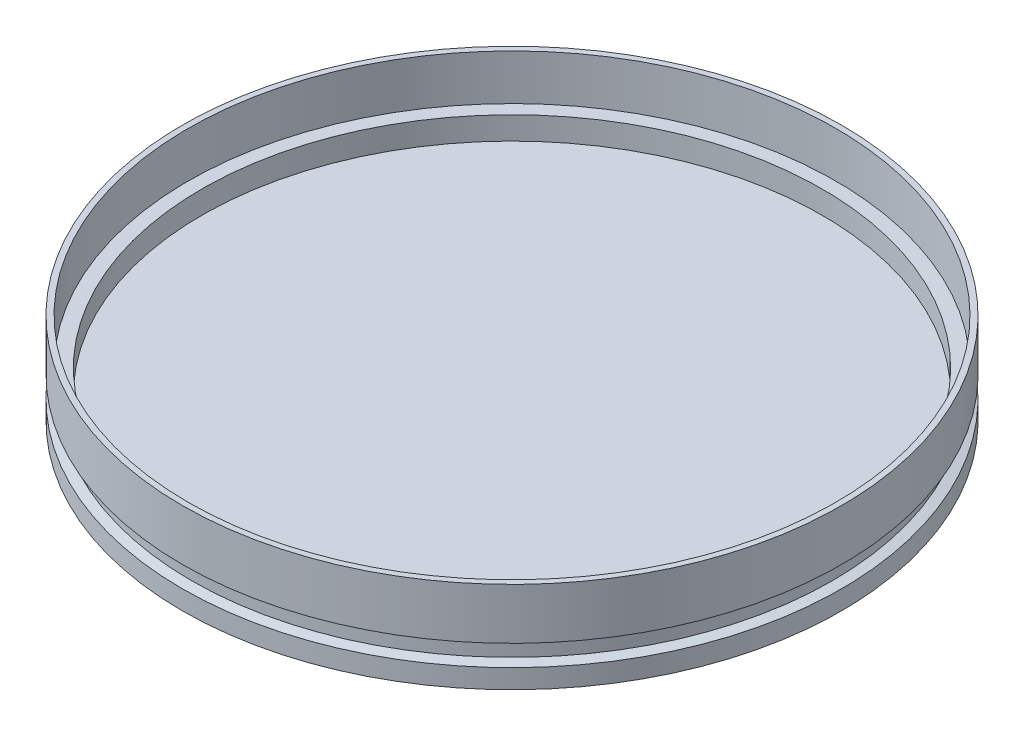
ISO-10303-21;
HEADER;
FILE_DESCRIPTION(('STEP AP214'),'2;1');
FILE_NAME('part.step','',(''),(''),'','','');
FILE_SCHEMA(('AUTOMOTIVE_DESIGN { 1 0 10303 214 1 1 1 1 }'));
ENDSEC;
DATA;
#1=APPLICATION_CONTEXT('core data for automotive mechanical design processes');
#2=APPLICATION_PROTOCOL_DEFINITION('international standard','automotive_design',2000,#1);
#3=PRODUCT_CONTEXT('',#1,'mechanical');
#4=PRODUCT('Part','Part','',(#3));
#5=PRODUCT_RELATED_PRODUCT_CATEGORY('part','',(#4));
#6=PRODUCT_DEFINITION_FORMATION('','',#4);
#7=PRODUCT_DEFINITION_CONTEXT('part definition',#1,'design');
#8=PRODUCT_DEFINITION('design','',#6,#7);
#9=PRODUCT_DEFINITION_SHAPE('','',#8);
#10=(LENGTH_UNIT() NAMED_UNIT(*) SI_UNIT(.MILLI.,.METRE.));
#11=(NAMED_UNIT(*) PLANE_ANGLE_UNIT() SI_UNIT($,.RADIAN.));
#12=(NAMED_UNIT(*) SI_UNIT($,.STERADIAN.) SOLID_ANGLE_UNIT());
#13=UNCERTAINTY_MEASURE_WITH_UNIT(LENGTH_MEASURE(1.E-05),#10,'distance_accuracy_value','');
#14=(GEOMETRIC_REPRESENTATION_CONTEXT(3) GLOBAL_UNCERTAINTY_ASSIGNED_CONTEXT((#13)) GLOBAL_UNIT_ASSIGNED_CONTEXT((#10,
#11,#12)) REPRESENTATION_CONTEXT('',''));
#15=CARTESIAN_POINT('',(0.,0.,0.));
#16=DIRECTION('',(0.,0.,1.));
#17=DIRECTION('',(1.,0.,0.));
#18=AXIS2_PLACEMENT_3D('',#15,#16,#17);
#19=CARTESIAN_POINT('',(0.,20.,0.));
#20=DIRECTION('',(0.,-1.,0.));
#21=DIRECTION('',(0.,0.,-1.));
#22=AXIS2_PLACEMENT_3D('',#19,#20,#21);
#23=CYLINDRICAL_SURFACE('',#22,72.25);
#24=CARTESIAN_POINT('',(0.,8.80384757729339,0.));
#25=DIRECTION('',(0.,1.,0.));
#26=DIRECTION('',(0.,0.,1.));
#27=AXIS2_PLACEMENT_3D('',#24,#25,#26);
#28=CIRCLE('',#27,72.25);
#29=CARTESIAN_POINT('',(0.,8.80384757729339,72.25));
#30=VERTEX_POINT('',#29);
#31=EDGE_CURVE('E52',#30,#30,#28,.T.);
#32=ORIENTED_EDGE('',*,*,#31,.T.);
#33=EDGE_LOOP('',(#32));
#34=FACE_BOUND('',#33,.T.);
#35=CARTESIAN_POINT('',(0.,20.,0.));
#36=DIRECTION('',(0.,1.,0.));
#37=DIRECTION('',(0.,0.,1.));
#38=AXIS2_PLACEMENT_3D('',#35,#36,#37);
#39=CIRCLE('',#38,72.25);
#40=CARTESIAN_POINT('',(0.,20.,72.25));
#41=VERTEX_POINT('',#40);
#42=EDGE_CURVE('E58',#41,#41,#39,.T.);
#43=ORIENTED_EDGE('',*,*,#42,.F.);
#44=EDGE_LOOP('',(#43));
#45=FACE_BOUND('',#44,.T.);
#46=ADVANCED_FACE('F32',(#34,#45),#23,.T.);
#47=CARTESIAN_POINT('',(0.,20.,0.));
#48=DIRECTION('',(0.,-1.,0.));
#49=DIRECTION('',(0.,0.,-1.));
#50=AXIS2_PLACEMENT_3D('',#47,#48,#49);
#51=CYLINDRICAL_SURFACE('',#50,71.);
#52=CARTESIAN_POINT('',(0.,10.,0.));
#53=DIRECTION('',(0.,1.,0.));
#54=DIRECTION('',(0.,0.,1.));
#55=AXIS2_PLACEMENT_3D('',#52,#53,#54);
#56=CIRCLE('',#55,71.);
#57=CARTESIAN_POINT('',(0.,10.,71.));
#58=VERTEX_POINT('',#57);
#59=EDGE_CURVE('E55',#58,#58,#56,.T.);
#60=ORIENTED_EDGE('',*,*,#59,.F.);
#61=EDGE_LOOP('',(#60));
#62=FACE_BOUND('',#61,.T.);
#63=CARTESIAN_POINT('',(0.,20.,0.));
#64=DIRECTION('',(0.,1.,0.));
#65=DIRECTION('',(0.,0.,1.));
#66=AXIS2_PLACEMENT_3D('',#63,#64,#65);
#67=CIRCLE('',#66,71.);
#68=CARTESIAN_POINT('',(0.,20.,71.));
#69=VERTEX_POINT('',#68);
#70=EDGE_CURVE('E62',#69,#69,#67,.T.);
#71=ORIENTED_EDGE('',*,*,#70,.T.);
#72=EDGE_LOOP('',(#71));
#73=FACE_BOUND('',#72,.T.);
#74=ADVANCED_FACE('F80',(#62,#73),#51,.F.);
#75=CARTESIAN_POINT('',(0.,4.19615242270661,0.));
#76=DIRECTION('',(0.,-1.,0.));
#77=DIRECTION('',(0.,0.,-1.));
#78=AXIS2_PLACEMENT_3D('',#75,#76,#77);
#79=CIRCLE('',#78,72.25);
#80=CARTESIAN_POINT('',(0.,4.19615242270661,-72.25));
#81=VERTEX_POINT('',#80);
#82=EDGE_CURVE('E43',#81,#81,#79,.T.);
#83=ORIENTED_EDGE('',*,*,#82,.T.);
#84=EDGE_LOOP('',(#83));
#85=FACE_BOUND('',#84,.T.);
#86=CARTESIAN_POINT('',(0.,0.,0.));
#87=DIRECTION('',(0.,1.,0.));
#88=DIRECTION('',(0.,0.,1.));
#89=AXIS2_PLACEMENT_3D('',#86,#87,#88);
#90=CIRCLE('',#89,72.25);
#91=CARTESIAN_POINT('',(0.,0.,72.25));
#92=VERTEX_POINT('',#91);
#93=EDGE_CURVE('E59',#92,#92,#90,.T.);
#94=ORIENTED_EDGE('',*,*,#93,.T.);
#95=EDGE_LOOP('',(#94));
#96=FACE_BOUND('',#95,.T.);
#97=ADVANCED_FACE('F83',(#85,#96),#23,.T.);
#98=CARTESIAN_POINT('',(0.,20.,0.));
#99=DIRECTION('',(0.,1.,0.));
#100=DIRECTION('',(0.,0.,1.));
#101=AXIS2_PLACEMENT_3D('',#98,#99,#100);
#102=PLANE('',#101);
#103=ORIENTED_EDGE('',*,*,#70,.F.);
#104=EDGE_LOOP('',(#103));
#105=FACE_BOUND('',#104,.T.);
#106=ORIENTED_EDGE('',*,*,#42,.T.);
#107=EDGE_LOOP('',(#106));
#108=FACE_BOUND('',#107,.T.);
#109=ADVANCED_FACE('F87',(#105,#108),#102,.T.);
#110=CARTESIAN_POINT('',(0.,0.,0.));
#111=DIRECTION('',(0.,1.,0.));
#112=DIRECTION('',(0.,0.,1.));
#113=AXIS2_PLACEMENT_3D('',#110,#111,#112);
#114=PLANE('',#113);
#115=ORIENTED_EDGE('',*,*,#93,.F.);
#116=EDGE_LOOP('',(#115));
#117=FACE_BOUND('',#116,.T.);
#118=ADVANCED_FACE('F90',(#117),#114,.F.);
#119=CARTESIAN_POINT('',(0.,10.,0.));
#120=DIRECTION('',(0.,-1.,0.));
#121=DIRECTION('',(0.,0.,-1.));
#122=AXIS2_PLACEMENT_3D('',#119,#120,#121);
#123=CYLINDRICAL_SURFACE('',#122,68.);
#124=CARTESIAN_POINT('',(0.,5.,0.));
#125=DIRECTION('',(0.,1.,0.));
#126=DIRECTION('',(0.,0.,1.));
#127=AXIS2_PLACEMENT_3D('',#124,#125,#126);
#128=CIRCLE('',#127,68.);
#129=CARTESIAN_POINT('',(0.,5.,68.));
#130=VERTEX_POINT('',#129);
#131=EDGE_CURVE('E10',#130,#130,#128,.T.);
#132=ORIENTED_EDGE('',*,*,#131,.F.);
#133=EDGE_LOOP('',(#132));
#134=FACE_BOUND('',#133,.T.);
#135=CARTESIAN_POINT('',(0.,10.,0.));
#136=DIRECTION('',(0.,1.,0.));
#137=DIRECTION('',(0.,0.,1.));
#138=AXIS2_PLACEMENT_3D('',#135,#136,#137);
#139=CIRCLE('',#138,68.);
#140=CARTESIAN_POINT('',(0.,10.,68.));
#141=VERTEX_POINT('',#140);
#142=EDGE_CURVE('E63',#141,#141,#139,.T.);
#143=ORIENTED_EDGE('',*,*,#142,.T.);
#144=EDGE_LOOP('',(#143));
#145=FACE_BOUND('',#144,.T.);
#146=ADVANCED_FACE('F71',(#134,#145),#123,.F.);
#147=CARTESIAN_POINT('',(0.,10.,0.));
#148=DIRECTION('',(0.,1.,0.));
#149=DIRECTION('',(0.,0.,1.));
#150=AXIS2_PLACEMENT_3D('',#147,#148,#149);
#151=PLANE('',#150);
#152=ORIENTED_EDGE('',*,*,#142,.F.);
#153=EDGE_LOOP('',(#152));
#154=FACE_BOUND('',#153,.T.);
#155=ORIENTED_EDGE('',*,*,#59,.T.);
#156=EDGE_LOOP('',(#155));
#157=FACE_BOUND('',#156,.T.);
#158=ADVANCED_FACE('F73',(#154,#157),#151,.T.);
#159=CARTESIAN_POINT('',(0.,0.,0.));
#160=DIRECTION('',(0.,-1.,0.));
#161=DIRECTION('',(0.,0.,-1.));
#162=AXIS2_PLACEMENT_3D('',#159,#160,#161);
#163=CYLINDRICAL_SURFACE('',#162,70.25);
#164=CARTESIAN_POINT('',(0.,4.73205080756887,0.));
#165=DIRECTION('',(0.,-1.,0.));
#166=DIRECTION('',(0.,0.,-1.));
#167=AXIS2_PLACEMENT_3D('',#164,#165,#166);
#168=CIRCLE('',#167,70.25);
#169=CARTESIAN_POINT('',(0.,4.73205080756887,-70.25));
#170=VERTEX_POINT('',#169);
#171=EDGE_CURVE('E39',#170,#170,#168,.F.);
#172=CARTESIAN_POINT('',(0.,8.26794919243113,0.));
#173=DIRECTION('',(0.,1.,0.));
#174=DIRECTION('',(0.,0.,1.));
#175=AXIS2_PLACEMENT_3D('',#172,#173,#174);
#176=CIRCLE('',#175,70.25);
#177=CARTESIAN_POINT('',(0.,8.26794919243113,-70.25));
#178=VERTEX_POINT('',#177);
#179=EDGE_CURVE('E47',#178,#178,#176,.F.);
#180=CARTESIAN_POINT('',(0.,4.73205080756887,-70.25));
#181=CARTESIAN_POINT('',(0.,4.76888308241118,-70.25));
#182=CARTESIAN_POINT('',(0.,4.8057153572535,-70.25));
#183=CARTESIAN_POINT('',(0.,4.87937990693813,-70.25));
#184=CARTESIAN_POINT('',(0.,4.91621218178045,-70.25));
#185=CARTESIAN_POINT('',(0.,4.98987673146508,-70.25));
#186=CARTESIAN_POINT('',(0.,5.02670900630739,-70.25));
#187=CARTESIAN_POINT('',(0.,5.10037355599202,-70.25));
#188=CARTESIAN_POINT('',(0.,5.13720583083434,-70.25));
#189=CARTESIAN_POINT('',(0.,5.21087038051897,-70.25));
#190=CARTESIAN_POINT('',(0.,5.24770265536128,-70.25));
#191=CARTESIAN_POINT('',(0.,5.32136720504591,-70.25));
#192=CARTESIAN_POINT('',(0.,5.35819947988823,-70.25));
#193=CARTESIAN_POINT('',(0.,5.43186402957286,-70.25));
#194=CARTESIAN_POINT('',(0.,5.46869630441517,-70.25));
#195=CARTESIAN_POINT('',(0.,5.5423608540998,-70.25));
#196=CARTESIAN_POINT('',(0.,5.57919312894212,-70.25));
#197=CARTESIAN_POINT('',(0.,5.65285767862675,-70.25));
#198=CARTESIAN_POINT('',(0.,5.68968995346906,-70.25));
#199=CARTESIAN_POINT('',(0.,5.7633545031537,-70.25));
#200=CARTESIAN_POINT('',(0.,5.80018677799601,-70.25));
#201=CARTESIAN_POINT('',(0.,5.87385132768064,-70.25));
#202=CARTESIAN_POINT('',(0.,5.91068360252296,-70.25));
#203=CARTESIAN_POINT('',(0.,5.98434815220759,-70.25));
#204=CARTESIAN_POINT('',(0.,6.0211804270499,-70.25));
#205=CARTESIAN_POINT('',(0.,6.09484497673453,-70.25));
#206=CARTESIAN_POINT('',(0.,6.13167725157685,-70.25));
#207=CARTESIAN_POINT('',(0.,6.20534180126148,-70.25));
#208=CARTESIAN_POINT('',(0.,6.24217407610379,-70.25));
#209=CARTESIAN_POINT('',(0.,6.31583862578842,-70.25));
#210=CARTESIAN_POINT('',(0.,6.35267090063074,-70.25));
#211=CARTESIAN_POINT('',(0.,6.42633545031537,-70.25));
#212=CARTESIAN_POINT('',(0.,6.46316772515768,-70.25));
#213=CARTESIAN_POINT('',(0.,6.53683227484231,-70.25));
#214=CARTESIAN_POINT('',(0.,6.57366454968463,-70.25));
#215=CARTESIAN_POINT('',(0.,6.64732909936926,-70.25));
#216=CARTESIAN_POINT('',(0.,6.68416137421158,-70.25));
#217=CARTESIAN_POINT('',(0.,6.75782592389621,-70.25));
#218=CARTESIAN_POINT('',(0.,6.79465819873852,-70.25));
#219=CARTESIAN_POINT('',(0.,6.86832274842315,-70.25));
#220=CARTESIAN_POINT('',(0.,6.90515502326547,-70.25));
#221=CARTESIAN_POINT('',(0.,6.9788195729501,-70.25));
#222=CARTESIAN_POINT('',(0.,7.01565184779241,-70.25));
#223=CARTESIAN_POINT('',(0.,7.08931639747704,-70.25));
#224=CARTESIAN_POINT('',(0.,7.12614867231936,-70.25));
#225=CARTESIAN_POINT('',(0.,7.19981322200399,-70.25));
#226=CARTESIAN_POINT('',(0.,7.2366454968463,-70.25));
#227=CARTESIAN_POINT('',(0.,7.31031004653093,-70.25));
#228=CARTESIAN_POINT('',(0.,7.34714232137325,-70.25));
#229=CARTESIAN_POINT('',(0.,7.42080687105788,-70.25));
#230=CARTESIAN_POINT('',(0.,7.4576391459002,-70.25));
#231=CARTESIAN_POINT('',(0.,7.53130369558483,-70.25));
#232=CARTESIAN_POINT('',(0.,7.56813597042714,-70.25));
#233=CARTESIAN_POINT('',(0.,7.64180052011177,-70.25));
#234=CARTESIAN_POINT('',(0.,7.67863279495409,-70.25));
#235=CARTESIAN_POINT('',(0.,7.75229734463872,-70.25));
#236=CARTESIAN_POINT('',(0.,7.78912961948103,-70.25));
#237=CARTESIAN_POINT('',(0.,7.86279416916566,-70.25));
#238=CARTESIAN_POINT('',(0.,7.89962644400798,-70.25));
#239=CARTESIAN_POINT('',(0.,7.97329099369261,-70.25));
#240=CARTESIAN_POINT('',(0.,8.01012326853492,-70.25));
#241=CARTESIAN_POINT('',(0.,8.08378781821956,-70.25));
#242=CARTESIAN_POINT('',(0.,8.12062009306187,-70.25));
#243=CARTESIAN_POINT('',(0.,8.1942846427465,-70.25));
#244=CARTESIAN_POINT('',(0.,8.23111691758882,-70.25));
#245=CARTESIAN_POINT('',(0.,8.26794919243113,-70.25));
#246=B_SPLINE_CURVE_WITH_KNOTS('',3,(#180,#181,#182,#183,#184,#185,#186,#187,#188,#189,#190,
#191,#192,#193,#194,#195,#196,#197,#198,#199,#200,#201,#202,#203,#204,#205,#206,#207,#208,#209,
#210,#211,#212,#213,#214,#215,#216,#217,#218,#219,#220,#221,#222,#223,#224,#225,#226,#227,#228,
#229,#230,#231,#232,#233,#234,#235,#236,#237,#238,#239,#240,#241,#242,#243,#244,#245),
.UNSPECIFIED.,.F.,.F.,(4,2,2,2,2,2,2,2,2,2,2,2,2,2,2,2,2,2,2,2,2,2,2,2,2,2,2,2,2,2,2,2,4),(0.,
0.110496824526946,0.220993649053891,0.331490473580837,0.441987298107783,0.552484122634729,
0.662980947161674,0.773477771688619,0.883974596215566,0.99447142074251,1.10496824526946,
1.2154650697964,1.32596189432335,1.43645871885029,1.54695554337724,1.65745236790418,
1.76794919243113,1.87844601695808,1.98894284148502,2.09943966601197,2.20993649053891,
2.32043331506586,2.4309301395928,2.54142696411975,2.6519237886467,2.76242061317364,
2.87291743770059,2.98341426222753,3.09391108675448,3.20440791128142,3.31490473580837,
3.42540156033532,3.53589838486226),.UNSPECIFIED.);
#247=EDGE_CURVE('BSEAM76',#170,#178,#246,.T.);
#248=ORIENTED_EDGE('',*,*,#171,.T.);
#249=ORIENTED_EDGE('',*,*,#179,.T.);
#250=ORIENTED_EDGE('',*,*,#247,.T.);
#251=ORIENTED_EDGE('',*,*,#247,.F.);
#252=EDGE_LOOP('',(#248,#250,#249,#251));
#253=FACE_BOUND('',#252,.T.);
#254=ADVANCED_FACE('F76',(#253),#163,.T.);
#255=CARTESIAN_POINT('',(0.,8.,0.));
#256=DIRECTION('',(0.,1.,0.));
#257=DIRECTION('',(0.,0.,1.));
#258=AXIS2_PLACEMENT_3D('',#255,#256,#257);
#259=CONICAL_SURFACE('',#258,69.25,1.30899693899574);
#260=ORIENTED_EDGE('',*,*,#31,.F.);
#261=EDGE_LOOP('',(#260));
#262=FACE_BOUND('',#261,.T.);
#263=ORIENTED_EDGE('',*,*,#179,.F.);
#264=EDGE_LOOP('',(#263));
#265=FACE_BOUND('',#264,.T.);
#266=ADVANCED_FACE('F117',(#262,#265),#259,.T.);
#267=CARTESIAN_POINT('',(0.,4.19615242270661,0.));
#268=DIRECTION('',(0.,-1.,0.));
#269=DIRECTION('',(0.,0.,-1.));
#270=AXIS2_PLACEMENT_3D('',#267,#268,#269);
#271=CONICAL_SURFACE('',#270,72.25,1.30899693899574);
#272=CARTESIAN_POINT('',(0.,4.73205080756887,-70.25));
#273=CARTESIAN_POINT('',(0.,4.72646853272655,-70.2708333333333));
#274=CARTESIAN_POINT('',(0.,4.72088625788424,-70.2916666666667));
#275=CARTESIAN_POINT('',(0.,4.70972170819961,-70.3333333333333));
#276=CARTESIAN_POINT('',(0.,4.70413943335729,-70.3541666666667));
#277=CARTESIAN_POINT('',(0.,4.69297488367266,-70.3958333333333));
#278=CARTESIAN_POINT('',(0.,4.68739260883035,-70.4166666666667));
#279=CARTESIAN_POINT('',(0.,4.67622805914572,-70.4583333333333));
#280=CARTESIAN_POINT('',(0.,4.6706457843034,-70.4791666666667));
#281=CARTESIAN_POINT('',(0.,4.65948123461877,-70.5208333333333));
#282=CARTESIAN_POINT('',(0.,4.65389895977646,-70.5416666666667));
#283=CARTESIAN_POINT('',(0.,4.64273441009183,-70.5833333333333));
#284=CARTESIAN_POINT('',(0.,4.63715213524951,-70.6041666666667));
#285=CARTESIAN_POINT('',(0.,4.62598758556488,-70.6458333333333));
#286=CARTESIAN_POINT('',(0.,4.62040531072256,-70.6666666666667));
#287=CARTESIAN_POINT('',(0.,4.60924076103793,-70.7083333333333));
#288=CARTESIAN_POINT('',(0.,4.60365848619562,-70.7291666666667));
#289=CARTESIAN_POINT('',(0.,4.59249393651099,-70.7708333333333));
#290=CARTESIAN_POINT('',(0.,4.58691166166867,-70.7916666666667));
#291=CARTESIAN_POINT('',(0.,4.57574711198404,-70.8333333333333));
#292=CARTESIAN_POINT('',(0.,4.57016483714173,-70.8541666666667));
#293=CARTESIAN_POINT('',(0.,4.5590002874571,-70.8958333333333));
#294=CARTESIAN_POINT('',(0.,4.55341801261478,-70.9166666666667));
#295=CARTESIAN_POINT('',(0.,4.54225346293015,-70.9583333333333));
#296=CARTESIAN_POINT('',(0.,4.53667118808784,-70.9791666666667));
#297=CARTESIAN_POINT('',(0.,4.52550663840321,-71.0208333333333));
#298=CARTESIAN_POINT('',(0.,4.51992436356089,-71.0416666666667));
#299=CARTESIAN_POINT('',(0.,4.50875981387626,-71.0833333333333));
#300=CARTESIAN_POINT('',(0.,4.50317753903395,-71.1041666666667));
#301=CARTESIAN_POINT('',(0.,4.49201298934932,-71.1458333333333));
#302=CARTESIAN_POINT('',(0.,4.486430714507,-71.1666666666667));
#303=CARTESIAN_POINT('',(0.,4.47526616482237,-71.2083333333333));
#304=CARTESIAN_POINT('',(0.,4.46968388998005,-71.2291666666667));
#305=CARTESIAN_POINT('',(0.,4.45851934029542,-71.2708333333333));
#306=CARTESIAN_POINT('',(0.,4.45293706545311,-71.2916666666667));
#307=CARTESIAN_POINT('',(0.,4.44177251576848,-71.3333333333333));
#308=CARTESIAN_POINT('',(0.,4.43619024092616,-71.3541666666667));
#309=CARTESIAN_POINT('',(0.,4.42502569124153,-71.3958333333333));
#310=CARTESIAN_POINT('',(0.,4.41944341639922,-71.4166666666667));
#311=CARTESIAN_POINT('',(0.,4.40827886671459,-71.4583333333333));
#312=CARTESIAN_POINT('',(0.,4.40269659187227,-71.4791666666667));
#313=CARTESIAN_POINT('',(0.,4.39153204218764,-71.5208333333333));
#314=CARTESIAN_POINT('',(0.,4.38594976734532,-71.5416666666667));
#315=CARTESIAN_POINT('',(0.,4.37478521766069,-71.5833333333333));
#316=CARTESIAN_POINT('',(0.,4.36920294281838,-71.6041666666667));
#317=CARTESIAN_POINT('',(0.,4.35803839313375,-71.6458333333333));
#318=CARTESIAN_POINT('',(0.,4.35245611829143,-71.6666666666667));
#319=CARTESIAN_POINT('',(0.,4.3412915686068,-71.7083333333333));
#320=CARTESIAN_POINT('',(0.,4.33570929376449,-71.7291666666667));
#321=CARTESIAN_POINT('',(0.,4.32454474407986,-71.7708333333333));
#322=CARTESIAN_POINT('',(0.,4.31896246923754,-71.7916666666667));
#323=CARTESIAN_POINT('',(0.,4.30779791955291,-71.8333333333333));
#324=CARTESIAN_POINT('',(0.,4.3022156447106,-71.8541666666667));
#325=CARTESIAN_POINT('',(0.,4.29105109502597,-71.8958333333333));
#326=CARTESIAN_POINT('',(0.,4.28546882018365,-71.9166666666667));
#327=CARTESIAN_POINT('',(0.,4.27430427049902,-71.9583333333333));
#328=CARTESIAN_POINT('',(0.,4.26872199565671,-71.9791666666667));
#329=CARTESIAN_POINT('',(0.,4.25755744597208,-72.0208333333333));
#330=CARTESIAN_POINT('',(0.,4.25197517112976,-72.0416666666667));
#331=CARTESIAN_POINT('',(0.,4.24081062144513,-72.0833333333333));
#332=CARTESIAN_POINT('',(0.,4.23522834660282,-72.1041666666667));
#333=CARTESIAN_POINT('',(0.,4.22406379691818,-72.1458333333333));
#334=CARTESIAN_POINT('',(0.,4.21848152207587,-72.1666666666667));
#335=CARTESIAN_POINT('',(0.,4.20731697239124,-72.2083333333333));
#336=CARTESIAN_POINT('',(0.,4.20173469754892,-72.2291666666667));
#337=CARTESIAN_POINT('',(0.,4.19615242270661,-72.25));
#338=B_SPLINE_CURVE_WITH_KNOTS('',3,(#272,#273,#274,#275,#276,#277,#278,#279,#280,#281,#282,
#283,#284,#285,#286,#287,#288,#289,#290,#291,#292,#293,#294,#295,#296,#297,#298,#299,#300,#301,
#302,#303,#304,#305,#306,#307,#308,#309,#310,#311,#312,#313,#314,#315,#316,#317,#318,#319,#320,
#321,#322,#323,#324,#325,#326,#327,#328,#329,#330,#331,#332,#333,#334,#335,#336,#337),
.UNSPECIFIED.,.F.,.F.,(4,2,2,2,2,2,2,2,2,2,2,2,2,2,2,2,2,2,2,2,2,2,2,2,2,2,2,2,2,2,2,2,4),(0.,
0.0647047612756237,0.129409522551261,0.194114283826884,0.258819045102522,0.323523806378145,
0.388228567653782,0.452933328929406,0.517638090205043,0.582342851480667,0.647047612756304,
0.711752374031928,0.776457135307565,0.841161896583188,0.905866657858825,0.970571419134449,
1.03527618041009,1.09998094168571,1.16468570296135,1.22939046423697,1.29409522551261,
1.35879998678823,1.42350474806387,1.48820950933949,1.55291427061513,1.61761903189075,
1.68232379316639,1.74702855444201,1.81173331571765,1.87643807699327,1.94114283826891,
2.00584759954453,2.07055236082017),.UNSPECIFIED.);
#339=EDGE_CURVE('BSEAM34',#170,#81,#338,.T.);
#340=ORIENTED_EDGE('',*,*,#171,.F.);
#341=ORIENTED_EDGE('',*,*,#82,.F.);
#342=ORIENTED_EDGE('',*,*,#339,.T.);
#343=ORIENTED_EDGE('',*,*,#339,.F.);
#344=EDGE_LOOP('',(#340,#342,#341,#343));
#345=FACE_BOUND('',#344,.T.);
#346=ADVANCED_FACE('F34',(#345),#271,.T.);
#347=CARTESIAN_POINT('',(0.,5.,0.));
#348=DIRECTION('',(0.,1.,0.));
#349=DIRECTION('',(0.,0.,1.));
#350=AXIS2_PLACEMENT_3D('',#347,#348,#349);
#351=PLANE('',#350);
#352=ORIENTED_EDGE('',*,*,#131,.T.);
#353=EDGE_LOOP('',(#352));
#354=FACE_BOUND('',#353,.T.);
#355=ADVANCED_FACE('F118',(#354),#351,.T.);
#356=CLOSED_SHELL('',(#46,#74,#97,#109,#118,#146,#158,#254,#266,#346,#355));
#357=MANIFOLD_SOLID_BREP('B2',#356);
#358=ADVANCED_BREP_SHAPE_REPRESENTATION('',(#18,#357),#14);
#359=SHAPE_DEFINITION_REPRESENTATION(#9,#358);
ENDSEC;
END-ISO-10303-21;
